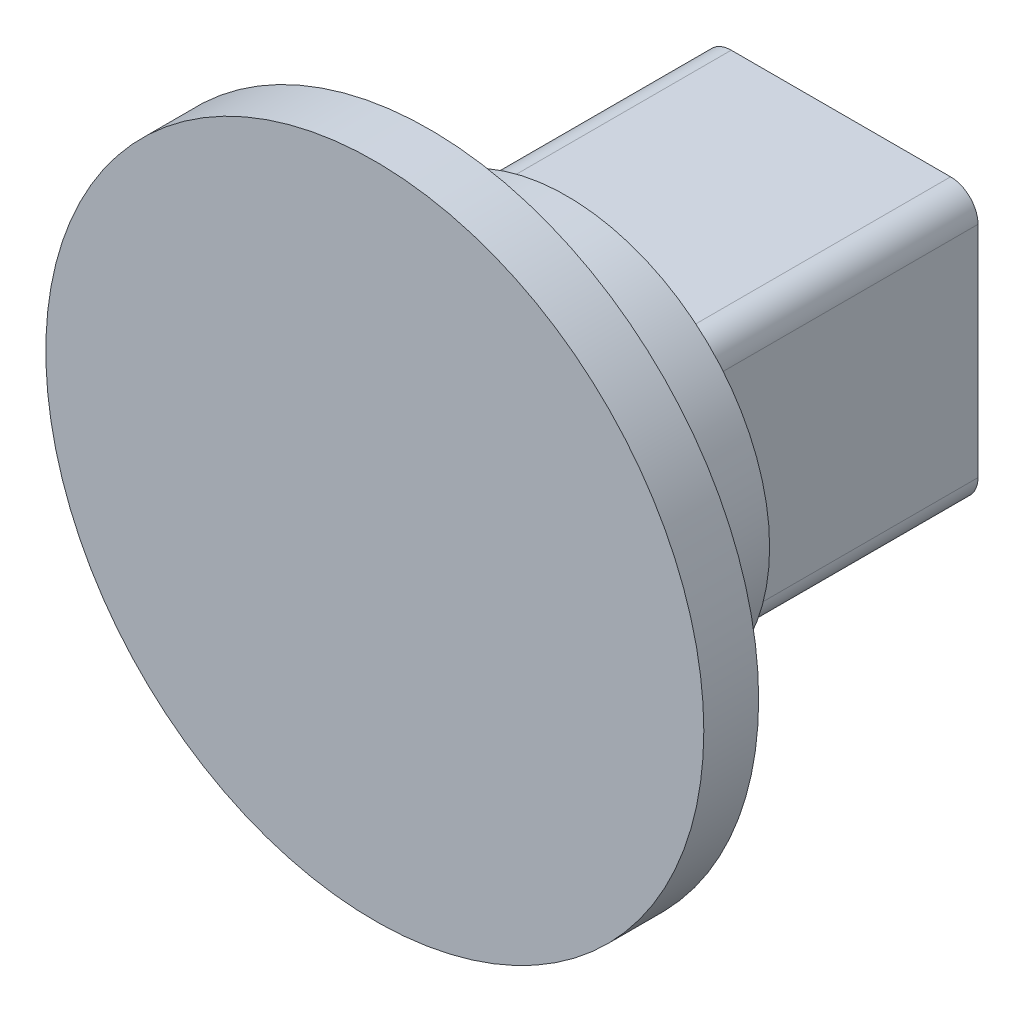
ISO-10303-21;
HEADER;
FILE_DESCRIPTION(('STEP AP214'),'2;1');
FILE_NAME('part.step','',(''),(''),'','','');
FILE_SCHEMA(('AUTOMOTIVE_DESIGN { 1 0 10303 214 1 1 1 1 }'));
ENDSEC;
DATA;
#1=APPLICATION_CONTEXT('core data for automotive mechanical design processes');
#2=APPLICATION_PROTOCOL_DEFINITION('international standard','automotive_design',2000,#1);
#3=PRODUCT_CONTEXT('',#1,'mechanical');
#4=PRODUCT('Part','Part','',(#3));
#5=PRODUCT_RELATED_PRODUCT_CATEGORY('part','',(#4));
#6=PRODUCT_DEFINITION_FORMATION('','',#4);
#7=PRODUCT_DEFINITION_CONTEXT('part definition',#1,'design');
#8=PRODUCT_DEFINITION('design','',#6,#7);
#9=PRODUCT_DEFINITION_SHAPE('','',#8);
#10=(LENGTH_UNIT() NAMED_UNIT(*) SI_UNIT(.MILLI.,.METRE.));
#11=(NAMED_UNIT(*) PLANE_ANGLE_UNIT() SI_UNIT($,.RADIAN.));
#12=(NAMED_UNIT(*) SI_UNIT($,.STERADIAN.) SOLID_ANGLE_UNIT());
#13=UNCERTAINTY_MEASURE_WITH_UNIT(LENGTH_MEASURE(1.E-05),#10,'distance_accuracy_value','');
#14=(GEOMETRIC_REPRESENTATION_CONTEXT(3) GLOBAL_UNCERTAINTY_ASSIGNED_CONTEXT((#13)) GLOBAL_UNIT_ASSIGNED_CONTEXT((#10,
#11,#12)) REPRESENTATION_CONTEXT('',''));
#15=CARTESIAN_POINT('',(0.,0.,0.));
#16=DIRECTION('',(0.,0.,1.));
#17=DIRECTION('',(1.,0.,0.));
#18=AXIS2_PLACEMENT_3D('',#15,#16,#17);
#19=CARTESIAN_POINT('',(-5.,-5.,-10.));
#20=DIRECTION('',(0.,-1.,0.));
#21=DIRECTION('',(0.,0.,-1.));
#22=AXIS2_PLACEMENT_3D('',#19,#20,#21);
#23=PLANE('',#22);
#24=DIRECTION('',(1.,0.,0.));
#25=VECTOR('',#24,1.);
#26=CARTESIAN_POINT('',(-5.,-5.,0.));
#27=LINE('',#26,#25);
#28=CARTESIAN_POINT('',(-4.,-5.,0.));
#29=VERTEX_POINT('',#28);
#30=CARTESIAN_POINT('',(4.,-5.,0.));
#31=VERTEX_POINT('',#30);
#32=EDGE_CURVE('E102',#29,#31,#27,.T.);
#33=ORIENTED_EDGE('',*,*,#32,.F.);
#34=DIRECTION('',(0.,0.,1.));
#35=VECTOR('',#34,1.);
#36=CARTESIAN_POINT('',(-4.,-5.,-10.));
#37=LINE('',#36,#35);
#38=CARTESIAN_POINT('',(-4.,-5.,-10.));
#39=VERTEX_POINT('',#38);
#40=EDGE_CURVE('E144',#29,#39,#37,.F.);
#41=ORIENTED_EDGE('',*,*,#40,.T.);
#42=DIRECTION('',(1.,0.,0.));
#43=VECTOR('',#42,1.);
#44=CARTESIAN_POINT('',(-5.,-5.,-10.));
#45=LINE('',#44,#43);
#46=CARTESIAN_POINT('',(4.,-5.,-10.));
#47=VERTEX_POINT('',#46);
#48=EDGE_CURVE('E159',#39,#47,#45,.T.);
#49=ORIENTED_EDGE('',*,*,#48,.T.);
#50=DIRECTION('',(0.,0.,1.));
#51=VECTOR('',#50,1.);
#52=CARTESIAN_POINT('',(4.,-5.,-10.));
#53=LINE('',#52,#51);
#54=EDGE_CURVE('E142',#47,#31,#53,.T.);
#55=ORIENTED_EDGE('',*,*,#54,.T.);
#56=EDGE_LOOP('',(#33,#41,#49,#55));
#57=FACE_BOUND('',#56,.T.);
#58=ADVANCED_FACE('F37',(#57),#23,.T.);
#59=CARTESIAN_POINT('',(-5.,-5.,-10.));
#60=DIRECTION('',(1.,0.,0.));
#61=DIRECTION('',(0.,1.,0.));
#62=AXIS2_PLACEMENT_3D('',#59,#60,#61);
#63=PLANE('',#62);
#64=DIRECTION('',(0.,1.,0.));
#65=VECTOR('',#64,1.);
#66=CARTESIAN_POINT('',(-5.,-5.,0.));
#67=LINE('',#66,#65);
#68=CARTESIAN_POINT('',(-5.,-4.,0.));
#69=VERTEX_POINT('',#68);
#70=CARTESIAN_POINT('',(-5.,4.,0.));
#71=VERTEX_POINT('',#70);
#72=EDGE_CURVE('E123',#69,#71,#67,.T.);
#73=ORIENTED_EDGE('',*,*,#72,.T.);
#74=DIRECTION('',(0.,0.,1.));
#75=VECTOR('',#74,1.);
#76=CARTESIAN_POINT('',(-5.,4.,-10.));
#77=LINE('',#76,#75);
#78=CARTESIAN_POINT('',(-5.,4.,-10.));
#79=VERTEX_POINT('',#78);
#80=EDGE_CURVE('E140',#71,#79,#77,.F.);
#81=ORIENTED_EDGE('',*,*,#80,.T.);
#82=DIRECTION('',(0.,1.,0.));
#83=VECTOR('',#82,1.);
#84=CARTESIAN_POINT('',(-5.,-5.,-10.));
#85=LINE('',#84,#83);
#86=CARTESIAN_POINT('',(-5.,-4.,-10.));
#87=VERTEX_POINT('',#86);
#88=EDGE_CURVE('E115',#87,#79,#85,.T.);
#89=ORIENTED_EDGE('',*,*,#88,.F.);
#90=DIRECTION('',(0.,0.,1.));
#91=VECTOR('',#90,1.);
#92=CARTESIAN_POINT('',(-5.,-4.,0.));
#93=LINE('',#92,#91);
#94=EDGE_CURVE('E137',#87,#69,#93,.T.);
#95=ORIENTED_EDGE('',*,*,#94,.T.);
#96=EDGE_LOOP('',(#73,#81,#89,#95));
#97=FACE_BOUND('',#96,.T.);
#98=ADVANCED_FACE('F156',(#97),#63,.F.);
#99=CARTESIAN_POINT('',(-5.,5.,-10.));
#100=DIRECTION('',(0.,-1.,0.));
#101=DIRECTION('',(0.,0.,-1.));
#102=AXIS2_PLACEMENT_3D('',#99,#100,#101);
#103=PLANE('',#102);
#104=DIRECTION('',(1.,0.,0.));
#105=VECTOR('',#104,1.);
#106=CARTESIAN_POINT('',(-5.,5.,0.));
#107=LINE('',#106,#105);
#108=CARTESIAN_POINT('',(-4.,5.,0.));
#109=VERTEX_POINT('',#108);
#110=CARTESIAN_POINT('',(4.,5.,0.));
#111=VERTEX_POINT('',#110);
#112=EDGE_CURVE('E111',#109,#111,#107,.T.);
#113=ORIENTED_EDGE('',*,*,#112,.T.);
#114=DIRECTION('',(0.,0.,1.));
#115=VECTOR('',#114,1.);
#116=CARTESIAN_POINT('',(4.,5.,-10.));
#117=LINE('',#116,#115);
#118=CARTESIAN_POINT('',(4.,5.,-10.));
#119=VERTEX_POINT('',#118);
#120=EDGE_CURVE('E128',#111,#119,#117,.F.);
#121=ORIENTED_EDGE('',*,*,#120,.T.);
#122=DIRECTION('',(1.,0.,0.));
#123=VECTOR('',#122,1.);
#124=CARTESIAN_POINT('',(-5.,5.,-10.));
#125=LINE('',#124,#123);
#126=CARTESIAN_POINT('',(-4.,5.,-10.));
#127=VERTEX_POINT('',#126);
#128=EDGE_CURVE('E120',#127,#119,#125,.T.);
#129=ORIENTED_EDGE('',*,*,#128,.F.);
#130=DIRECTION('',(0.,0.,1.));
#131=VECTOR('',#130,1.);
#132=CARTESIAN_POINT('',(-4.,5.,-10.));
#133=LINE('',#132,#131);
#134=EDGE_CURVE('E117',#127,#109,#133,.T.);
#135=ORIENTED_EDGE('',*,*,#134,.T.);
#136=EDGE_LOOP('',(#113,#121,#129,#135));
#137=FACE_BOUND('',#136,.T.);
#138=ADVANCED_FACE('F168',(#137),#103,.F.);
#139=CARTESIAN_POINT('',(5.,-5.,-10.));
#140=DIRECTION('',(1.,0.,0.));
#141=DIRECTION('',(0.,0.,-1.));
#142=AXIS2_PLACEMENT_3D('',#139,#140,#141);
#143=PLANE('',#142);
#144=DIRECTION('',(0.,1.,0.));
#145=VECTOR('',#144,1.);
#146=CARTESIAN_POINT('',(5.,-5.,-10.));
#147=LINE('',#146,#145);
#148=CARTESIAN_POINT('',(5.,-4.,-10.));
#149=VERTEX_POINT('',#148);
#150=CARTESIAN_POINT('',(5.,4.,-10.));
#151=VERTEX_POINT('',#150);
#152=EDGE_CURVE('E170',#149,#151,#147,.T.);
#153=ORIENTED_EDGE('',*,*,#152,.T.);
#154=DIRECTION('',(0.,0.,1.));
#155=VECTOR('',#154,1.);
#156=CARTESIAN_POINT('',(5.,4.,0.));
#157=LINE('',#156,#155);
#158=CARTESIAN_POINT('',(5.,4.,0.));
#159=VERTEX_POINT('',#158);
#160=EDGE_CURVE('E110',#151,#159,#157,.T.);
#161=ORIENTED_EDGE('',*,*,#160,.T.);
#162=DIRECTION('',(0.,1.,0.));
#163=VECTOR('',#162,1.);
#164=CARTESIAN_POINT('',(5.,-5.,0.));
#165=LINE('',#164,#163);
#166=CARTESIAN_POINT('',(5.,-4.,0.));
#167=VERTEX_POINT('',#166);
#168=EDGE_CURVE('E101',#167,#159,#165,.T.);
#169=ORIENTED_EDGE('',*,*,#168,.F.);
#170=DIRECTION('',(0.,0.,1.));
#171=VECTOR('',#170,1.);
#172=CARTESIAN_POINT('',(5.,-4.,-10.));
#173=LINE('',#172,#171);
#174=EDGE_CURVE('E107',#167,#149,#173,.F.);
#175=ORIENTED_EDGE('',*,*,#174,.T.);
#176=EDGE_LOOP('',(#153,#161,#169,#175));
#177=FACE_BOUND('',#176,.T.);
#178=ADVANCED_FACE('F106',(#177),#143,.T.);
#179=CARTESIAN_POINT('',(0.,0.,-10.));
#180=DIRECTION('',(0.,0.,1.));
#181=DIRECTION('',(1.,0.,0.));
#182=AXIS2_PLACEMENT_3D('',#179,#180,#181);
#183=PLANE('',#182);
#184=ORIENTED_EDGE('',*,*,#128,.T.);
#185=CARTESIAN_POINT('',(4.,4.,-10.));
#186=DIRECTION('',(0.,0.,1.));
#187=DIRECTION('',(1.,0.,0.));
#188=AXIS2_PLACEMENT_3D('',#185,#186,#187);
#189=CIRCLE('',#188,1.);
#190=EDGE_CURVE('E135',#119,#151,#189,.F.);
#191=ORIENTED_EDGE('',*,*,#190,.T.);
#192=ORIENTED_EDGE('',*,*,#152,.F.);
#193=CARTESIAN_POINT('',(4.,-4.,-10.));
#194=DIRECTION('',(0.,0.,1.));
#195=DIRECTION('',(1.,0.,0.));
#196=AXIS2_PLACEMENT_3D('',#193,#194,#195);
#197=CIRCLE('',#196,1.);
#198=EDGE_CURVE('E114',#149,#47,#197,.F.);
#199=ORIENTED_EDGE('',*,*,#198,.T.);
#200=ORIENTED_EDGE('',*,*,#48,.F.);
#201=CARTESIAN_POINT('',(-4.,-4.,-10.));
#202=DIRECTION('',(0.,0.,1.));
#203=DIRECTION('',(1.,0.,0.));
#204=AXIS2_PLACEMENT_3D('',#201,#202,#203);
#205=CIRCLE('',#204,1.);
#206=EDGE_CURVE('E131',#39,#87,#205,.F.);
#207=ORIENTED_EDGE('',*,*,#206,.T.);
#208=ORIENTED_EDGE('',*,*,#88,.T.);
#209=CARTESIAN_POINT('',(-4.,4.,-10.));
#210=DIRECTION('',(0.,0.,1.));
#211=DIRECTION('',(1.,0.,0.));
#212=AXIS2_PLACEMENT_3D('',#209,#210,#211);
#213=CIRCLE('',#212,1.);
#214=EDGE_CURVE('E133',#79,#127,#213,.F.);
#215=ORIENTED_EDGE('',*,*,#214,.T.);
#216=EDGE_LOOP('',(#184,#191,#192,#199,#200,#207,#208,#215));
#217=FACE_BOUND('',#216,.T.);
#218=ADVANCED_FACE('F165',(#217),#183,.F.);
#219=CARTESIAN_POINT('',(0.,0.,0.));
#220=DIRECTION('',(0.,0.,1.));
#221=DIRECTION('',(1.,0.,0.));
#222=AXIS2_PLACEMENT_3D('',#219,#220,#221);
#223=PLANE('',#222);
#224=CARTESIAN_POINT('',(0.,0.,0.));
#225=DIRECTION('',(0.,0.,1.));
#226=DIRECTION('',(1.,0.,0.));
#227=AXIS2_PLACEMENT_3D('',#224,#225,#226);
#228=CIRCLE('',#227,7.4);
#229=CARTESIAN_POINT('',(7.4,0.,0.));
#230=VERTEX_POINT('',#229);
#231=EDGE_CURVE('E184',#230,#230,#228,.T.);
#232=ORIENTED_EDGE('',*,*,#231,.F.);
#233=EDGE_LOOP('',(#232));
#234=FACE_BOUND('',#233,.T.);
#235=ORIENTED_EDGE('',*,*,#72,.F.);
#236=CARTESIAN_POINT('',(-4.,-4.,0.));
#237=DIRECTION('',(0.,0.,1.));
#238=DIRECTION('',(1.,0.,0.));
#239=AXIS2_PLACEMENT_3D('',#236,#237,#238);
#240=CIRCLE('',#239,1.);
#241=EDGE_CURVE('E45',#69,#29,#240,.T.);
#242=ORIENTED_EDGE('',*,*,#241,.T.);
#243=ORIENTED_EDGE('',*,*,#32,.T.);
#244=CARTESIAN_POINT('',(4.,-4.,0.));
#245=DIRECTION('',(0.,0.,1.));
#246=DIRECTION('',(1.,0.,0.));
#247=AXIS2_PLACEMENT_3D('',#244,#245,#246);
#248=CIRCLE('',#247,1.);
#249=EDGE_CURVE('E11',#31,#167,#248,.T.);
#250=ORIENTED_EDGE('',*,*,#249,.T.);
#251=ORIENTED_EDGE('',*,*,#168,.T.);
#252=CARTESIAN_POINT('',(4.,4.,0.));
#253=DIRECTION('',(0.,0.,1.));
#254=DIRECTION('',(1.,0.,0.));
#255=AXIS2_PLACEMENT_3D('',#252,#253,#254);
#256=CIRCLE('',#255,1.);
#257=EDGE_CURVE('E146',#159,#111,#256,.T.);
#258=ORIENTED_EDGE('',*,*,#257,.T.);
#259=ORIENTED_EDGE('',*,*,#112,.F.);
#260=CARTESIAN_POINT('',(-4.,4.,0.));
#261=DIRECTION('',(0.,0.,1.));
#262=DIRECTION('',(1.,0.,0.));
#263=AXIS2_PLACEMENT_3D('',#260,#261,#262);
#264=CIRCLE('',#263,1.);
#265=EDGE_CURVE('E148',#109,#71,#264,.T.);
#266=ORIENTED_EDGE('',*,*,#265,.T.);
#267=EDGE_LOOP('',(#235,#242,#243,#250,#251,#258,#259,#266));
#268=FACE_BOUND('',#267,.T.);
#269=ADVANCED_FACE('F100',(#234,#268),#223,.F.);
#270=CARTESIAN_POINT('',(0.,0.,5.));
#271=DIRECTION('',(0.,0.,-1.));
#272=DIRECTION('',(-1.,0.,0.));
#273=AXIS2_PLACEMENT_3D('',#270,#271,#272);
#274=CYLINDRICAL_SURFACE('',#273,7.4);
#275=CARTESIAN_POINT('',(0.,0.,5.));
#276=DIRECTION('',(0.,0.,1.));
#277=DIRECTION('',(1.,0.,0.));
#278=AXIS2_PLACEMENT_3D('',#275,#276,#277);
#279=CIRCLE('',#278,7.4);
#280=CARTESIAN_POINT('',(7.4,0.,5.));
#281=VERTEX_POINT('',#280);
#282=EDGE_CURVE('E175',#281,#281,#279,.T.);
#283=ORIENTED_EDGE('',*,*,#282,.F.);
#284=EDGE_LOOP('',(#283));
#285=FACE_BOUND('',#284,.T.);
#286=ORIENTED_EDGE('',*,*,#231,.T.);
#287=EDGE_LOOP('',(#286));
#288=FACE_BOUND('',#287,.T.);
#289=ADVANCED_FACE('F223',(#285,#288),#274,.T.);
#290=CARTESIAN_POINT('',(4.,4.,-10.));
#291=DIRECTION('',(0.,0.,-1.));
#292=DIRECTION('',(-1.,0.,0.));
#293=AXIS2_PLACEMENT_3D('',#290,#291,#292);
#294=CYLINDRICAL_SURFACE('',#293,1.);
#295=ORIENTED_EDGE('',*,*,#190,.F.);
#296=ORIENTED_EDGE('',*,*,#120,.F.);
#297=ORIENTED_EDGE('',*,*,#257,.F.);
#298=ORIENTED_EDGE('',*,*,#160,.F.);
#299=EDGE_LOOP('',(#295,#296,#297,#298));
#300=FACE_BOUND('',#299,.T.);
#301=ADVANCED_FACE('F177',(#300),#294,.T.);
#302=CARTESIAN_POINT('',(-4.,4.,-10.));
#303=DIRECTION('',(0.,0.,1.));
#304=DIRECTION('',(1.,0.,0.));
#305=AXIS2_PLACEMENT_3D('',#302,#303,#304);
#306=CYLINDRICAL_SURFACE('',#305,1.);
#307=ORIENTED_EDGE('',*,*,#214,.F.);
#308=ORIENTED_EDGE('',*,*,#80,.F.);
#309=ORIENTED_EDGE('',*,*,#265,.F.);
#310=ORIENTED_EDGE('',*,*,#134,.F.);
#311=EDGE_LOOP('',(#307,#308,#309,#310));
#312=FACE_BOUND('',#311,.T.);
#313=ADVANCED_FACE('F161',(#312),#306,.T.);
#314=CARTESIAN_POINT('',(-4.,-4.,-10.));
#315=DIRECTION('',(0.,0.,-1.));
#316=DIRECTION('',(-1.,0.,0.));
#317=AXIS2_PLACEMENT_3D('',#314,#315,#316);
#318=CYLINDRICAL_SURFACE('',#317,1.);
#319=ORIENTED_EDGE('',*,*,#206,.F.);
#320=ORIENTED_EDGE('',*,*,#40,.F.);
#321=ORIENTED_EDGE('',*,*,#241,.F.);
#322=ORIENTED_EDGE('',*,*,#94,.F.);
#323=EDGE_LOOP('',(#319,#320,#321,#322));
#324=FACE_BOUND('',#323,.T.);
#325=ADVANCED_FACE('F225',(#324),#318,.T.);
#326=CARTESIAN_POINT('',(4.,-4.,-10.));
#327=DIRECTION('',(0.,0.,1.));
#328=DIRECTION('',(1.,0.,0.));
#329=AXIS2_PLACEMENT_3D('',#326,#327,#328);
#330=CYLINDRICAL_SURFACE('',#329,1.);
#331=ORIENTED_EDGE('',*,*,#198,.F.);
#332=ORIENTED_EDGE('',*,*,#174,.F.);
#333=ORIENTED_EDGE('',*,*,#249,.F.);
#334=ORIENTED_EDGE('',*,*,#54,.F.);
#335=EDGE_LOOP('',(#331,#332,#333,#334));
#336=FACE_BOUND('',#335,.T.);
#337=ADVANCED_FACE('F39',(#336),#330,.T.);
#338=CARTESIAN_POINT('',(0.,0.,7.));
#339=DIRECTION('',(0.,0.,-1.));
#340=DIRECTION('',(-1.,0.,0.));
#341=AXIS2_PLACEMENT_3D('',#338,#339,#340);
#342=CYLINDRICAL_SURFACE('',#341,12.);
#343=CARTESIAN_POINT('',(0.,0.,7.));
#344=DIRECTION('',(0.,0.,1.));
#345=DIRECTION('',(1.,0.,0.));
#346=AXIS2_PLACEMENT_3D('',#343,#344,#345);
#347=CIRCLE('',#346,12.);
#348=CARTESIAN_POINT('',(12.,0.,7.));
#349=VERTEX_POINT('',#348);
#350=EDGE_CURVE('E187',#349,#349,#347,.T.);
#351=ORIENTED_EDGE('',*,*,#350,.F.);
#352=EDGE_LOOP('',(#351));
#353=FACE_BOUND('',#352,.T.);
#354=CARTESIAN_POINT('',(0.,0.,5.));
#355=DIRECTION('',(0.,0.,1.));
#356=DIRECTION('',(1.,0.,0.));
#357=AXIS2_PLACEMENT_3D('',#354,#355,#356);
#358=CIRCLE('',#357,12.);
#359=CARTESIAN_POINT('',(12.,0.,5.));
#360=VERTEX_POINT('',#359);
#361=EDGE_CURVE('E190',#360,#360,#358,.T.);
#362=ORIENTED_EDGE('',*,*,#361,.T.);
#363=EDGE_LOOP('',(#362));
#364=FACE_BOUND('',#363,.T.);
#365=ADVANCED_FACE('F198',(#353,#364),#342,.T.);
#366=CARTESIAN_POINT('',(0.,0.,7.));
#367=DIRECTION('',(0.,0.,1.));
#368=DIRECTION('',(1.,0.,0.));
#369=AXIS2_PLACEMENT_3D('',#366,#367,#368);
#370=PLANE('',#369);
#371=ORIENTED_EDGE('',*,*,#350,.T.);
#372=EDGE_LOOP('',(#371));
#373=FACE_BOUND('',#372,.T.);
#374=ADVANCED_FACE('F196',(#373),#370,.T.);
#375=CARTESIAN_POINT('',(0.,0.,5.));
#376=DIRECTION('',(0.,0.,1.));
#377=DIRECTION('',(1.,0.,0.));
#378=AXIS2_PLACEMENT_3D('',#375,#376,#377);
#379=PLANE('',#378);
#380=ORIENTED_EDGE('',*,*,#282,.T.);
#381=EDGE_LOOP('',(#380));
#382=FACE_BOUND('',#381,.T.);
#383=ORIENTED_EDGE('',*,*,#361,.F.);
#384=EDGE_LOOP('',(#383));
#385=FACE_BOUND('',#384,.T.);
#386=ADVANCED_FACE('F204',(#382,#385),#379,.F.);
#387=CLOSED_SHELL('',(#58,#98,#138,#178,#218,#269,#289,#301,#313,#325,#337,#365,#374,#386));
#388=MANIFOLD_SOLID_BREP('B2',#387);
#389=ADVANCED_BREP_SHAPE_REPRESENTATION('',(#18,#388),#14);
#390=SHAPE_DEFINITION_REPRESENTATION(#9,#389);
ENDSEC;
END-ISO-10303-21;
